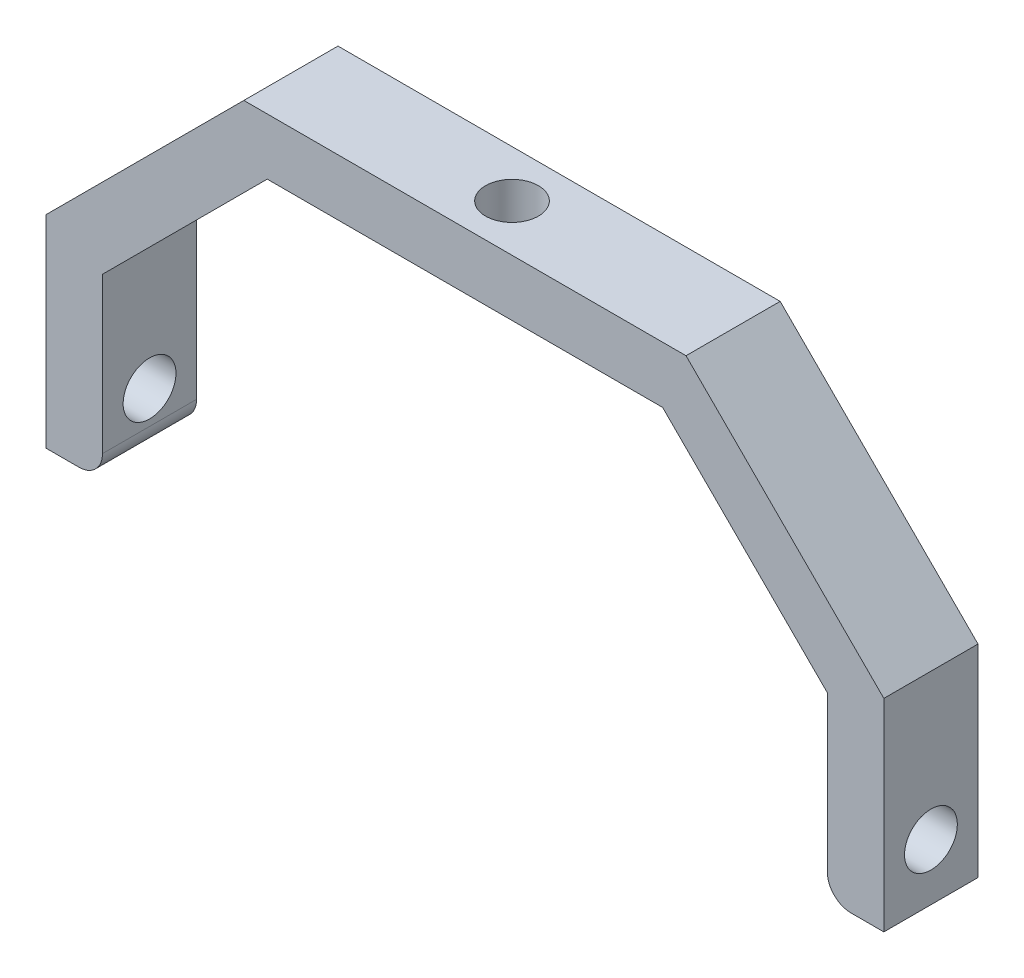
ISO-10303-21;
HEADER;
FILE_DESCRIPTION(('STEP AP214'),'2;1');
FILE_NAME('part.step','',(''),(''),'','','');
FILE_SCHEMA(('AUTOMOTIVE_DESIGN { 1 0 10303 214 1 1 1 1 }'));
ENDSEC;
DATA;
#1=APPLICATION_CONTEXT('core data for automotive mechanical design processes');
#2=APPLICATION_PROTOCOL_DEFINITION('international standard','automotive_design',2000,#1);
#3=PRODUCT_CONTEXT('',#1,'mechanical');
#4=PRODUCT('Part','Part','',(#3));
#5=PRODUCT_RELATED_PRODUCT_CATEGORY('part','',(#4));
#6=PRODUCT_DEFINITION_FORMATION('','',#4);
#7=PRODUCT_DEFINITION_CONTEXT('part definition',#1,'design');
#8=PRODUCT_DEFINITION('design','',#6,#7);
#9=PRODUCT_DEFINITION_SHAPE('','',#8);
#10=(LENGTH_UNIT() NAMED_UNIT(*) SI_UNIT(.MILLI.,.METRE.));
#11=(NAMED_UNIT(*) PLANE_ANGLE_UNIT() SI_UNIT($,.RADIAN.));
#12=(NAMED_UNIT(*) SI_UNIT($,.STERADIAN.) SOLID_ANGLE_UNIT());
#13=UNCERTAINTY_MEASURE_WITH_UNIT(LENGTH_MEASURE(1.E-05),#10,'distance_accuracy_value','');
#14=(GEOMETRIC_REPRESENTATION_CONTEXT(3) GLOBAL_UNCERTAINTY_ASSIGNED_CONTEXT((#13)) GLOBAL_UNIT_ASSIGNED_CONTEXT((#10,
#11,#12)) REPRESENTATION_CONTEXT('',''));
#15=CARTESIAN_POINT('',(0.,0.,0.));
#16=DIRECTION('',(0.,0.,1.));
#17=DIRECTION('',(1.,0.,0.));
#18=AXIS2_PLACEMENT_3D('',#15,#16,#17);
#19=CARTESIAN_POINT('',(-44.4999999999995,15.4852813742385,10.));
#20=DIRECTION('',(1.,0.,0.));
#21=DIRECTION('',(0.,1.,0.));
#22=AXIS2_PLACEMENT_3D('',#19,#20,#21);
#23=PLANE('',#22);
#24=CARTESIAN_POINT('',(-44.4999999999995,0.,5.));
#25=DIRECTION('',(-1.,0.,0.));
#26=DIRECTION('',(0.,0.,-1.));
#27=AXIS2_PLACEMENT_3D('',#24,#25,#26);
#28=CIRCLE('',#27,2.8067);
#29=CARTESIAN_POINT('',(-44.4999999999995,0.,2.1933));
#30=VERTEX_POINT('',#29);
#31=EDGE_CURVE('E457',#30,#30,#28,.T.);
#32=ORIENTED_EDGE('',*,*,#31,.F.);
#33=EDGE_LOOP('',(#32));
#34=FACE_BOUND('',#33,.T.);
#35=DIRECTION('',(0.,-1.,0.));
#36=VECTOR('',#35,1.);
#37=CARTESIAN_POINT('',(-44.4999999999995,15.4852813742385,0.));
#38=LINE('',#37,#36);
#39=CARTESIAN_POINT('',(-44.4999999999995,15.4852813742385,0.));
#40=VERTEX_POINT('',#39);
#41=CARTESIAN_POINT('',(-44.4999999999994,-6.,0.));
#42=VERTEX_POINT('',#41);
#43=EDGE_CURVE('E163',#40,#42,#38,.T.);
#44=ORIENTED_EDGE('',*,*,#43,.T.);
#45=DIRECTION('',(0.,0.,-1.));
#46=VECTOR('',#45,1.);
#47=CARTESIAN_POINT('',(-44.4999999999994,-6.,10.));
#48=LINE('',#47,#46);
#49=CARTESIAN_POINT('',(-44.4999999999994,-6.,10.));
#50=VERTEX_POINT('',#49);
#51=EDGE_CURVE('E145',#50,#42,#48,.T.);
#52=ORIENTED_EDGE('',*,*,#51,.F.);
#53=DIRECTION('',(0.,-1.,0.));
#54=VECTOR('',#53,1.);
#55=CARTESIAN_POINT('',(-44.4999999999995,15.4852813742385,10.));
#56=LINE('',#55,#54);
#57=CARTESIAN_POINT('',(-44.4999999999995,15.4852813742385,10.));
#58=VERTEX_POINT('',#57);
#59=EDGE_CURVE('E149',#58,#50,#56,.T.);
#60=ORIENTED_EDGE('',*,*,#59,.F.);
#61=DIRECTION('',(0.,0.,-1.));
#62=VECTOR('',#61,1.);
#63=CARTESIAN_POINT('',(-44.4999999999995,15.4852813742385,10.));
#64=LINE('',#63,#62);
#65=EDGE_CURVE('E239',#58,#40,#64,.T.);
#66=ORIENTED_EDGE('',*,*,#65,.T.);
#67=EDGE_LOOP('',(#44,#52,#60,#66));
#68=FACE_BOUND('',#67,.T.);
#69=ADVANCED_FACE('F41',(#34,#68),#23,.F.);
#70=CARTESIAN_POINT('',(-44.4999999999994,-6.,10.));
#71=DIRECTION('',(0.,1.,0.));
#72=DIRECTION('',(-1.,0.,0.));
#73=AXIS2_PLACEMENT_3D('',#70,#71,#72);
#74=PLANE('',#73);
#75=DIRECTION('',(1.,0.,0.));
#76=VECTOR('',#75,1.);
#77=CARTESIAN_POINT('',(-44.4999999999994,-6.,0.));
#78=LINE('',#77,#76);
#79=CARTESIAN_POINT('',(-40.9999999999994,-6.,0.));
#80=VERTEX_POINT('',#79);
#81=EDGE_CURVE('E207',#42,#80,#78,.T.);
#82=ORIENTED_EDGE('',*,*,#81,.T.);
#83=DIRECTION('',(0.,0.,-1.));
#84=VECTOR('',#83,1.);
#85=CARTESIAN_POINT('',(-40.9999999999994,-6.,10.));
#86=LINE('',#85,#84);
#87=CARTESIAN_POINT('',(-40.9999999999994,-6.,10.));
#88=VERTEX_POINT('',#87);
#89=EDGE_CURVE('E11',#80,#88,#86,.F.);
#90=ORIENTED_EDGE('',*,*,#89,.T.);
#91=DIRECTION('',(1.,0.,0.));
#92=VECTOR('',#91,1.);
#93=CARTESIAN_POINT('',(-44.4999999999994,-6.,10.));
#94=LINE('',#93,#92);
#95=EDGE_CURVE('E141',#50,#88,#94,.T.);
#96=ORIENTED_EDGE('',*,*,#95,.F.);
#97=ORIENTED_EDGE('',*,*,#51,.T.);
#98=EDGE_LOOP('',(#82,#90,#96,#97));
#99=FACE_BOUND('',#98,.T.);
#100=ADVANCED_FACE('F143',(#99),#74,.F.);
#101=CARTESIAN_POINT('',(-38.4999999999994,-6.,10.));
#102=DIRECTION('',(-1.,0.,0.));
#103=DIRECTION('',(0.,-1.,0.));
#104=AXIS2_PLACEMENT_3D('',#101,#102,#103);
#105=PLANE('',#104);
#106=CARTESIAN_POINT('',(-38.4999999999994,0.,5.));
#107=DIRECTION('',(-1.,0.,0.));
#108=DIRECTION('',(0.,-1.,0.));
#109=AXIS2_PLACEMENT_3D('',#106,#107,#108);
#110=CIRCLE('',#109,2.8067);
#111=CARTESIAN_POINT('',(-38.4999999999994,-2.8067,5.));
#112=VERTEX_POINT('',#111);
#113=EDGE_CURVE('E45',#112,#112,#110,.F.);
#114=ORIENTED_EDGE('',*,*,#113,.F.);
#115=EDGE_LOOP('',(#114));
#116=FACE_BOUND('',#115,.T.);
#117=DIRECTION('',(0.,1.,0.));
#118=VECTOR('',#117,1.);
#119=CARTESIAN_POINT('',(-38.4999999999994,-6.,10.));
#120=LINE('',#119,#118);
#121=CARTESIAN_POINT('',(-38.4999999999994,-3.49999999999998,10.));
#122=VERTEX_POINT('',#121);
#123=CARTESIAN_POINT('',(-38.4999999999995,13.,10.));
#124=VERTEX_POINT('',#123);
#125=EDGE_CURVE('E148',#122,#124,#120,.T.);
#126=ORIENTED_EDGE('',*,*,#125,.F.);
#127=DIRECTION('',(0.,0.,-1.));
#128=VECTOR('',#127,1.);
#129=CARTESIAN_POINT('',(-38.4999999999994,-3.49999999999998,10.));
#130=LINE('',#129,#128);
#131=CARTESIAN_POINT('',(-38.4999999999994,-3.49999999999998,0.));
#132=VERTEX_POINT('',#131);
#133=EDGE_CURVE('E51',#122,#132,#130,.T.);
#134=ORIENTED_EDGE('',*,*,#133,.T.);
#135=DIRECTION('',(0.,1.,0.));
#136=VECTOR('',#135,1.);
#137=CARTESIAN_POINT('',(-38.4999999999994,-6.,0.));
#138=LINE('',#137,#136);
#139=CARTESIAN_POINT('',(-38.4999999999995,13.,0.));
#140=VERTEX_POINT('',#139);
#141=EDGE_CURVE('E198',#132,#140,#138,.T.);
#142=ORIENTED_EDGE('',*,*,#141,.T.);
#143=DIRECTION('',(0.,0.,-1.));
#144=VECTOR('',#143,1.);
#145=CARTESIAN_POINT('',(-38.4999999999995,13.,10.));
#146=LINE('',#145,#144);
#147=EDGE_CURVE('E166',#124,#140,#146,.T.);
#148=ORIENTED_EDGE('',*,*,#147,.F.);
#149=EDGE_LOOP('',(#126,#134,#142,#148));
#150=FACE_BOUND('',#149,.T.);
#151=ADVANCED_FACE('F196',(#116,#150),#105,.F.);
#152=CARTESIAN_POINT('',(-38.4999999999995,13.,10.));
#153=DIRECTION('',(-0.707106781186566,0.707106781186529,0.));
#154=DIRECTION('',(-0.707106781186529,-0.707106781186566,0.));
#155=AXIS2_PLACEMENT_3D('',#152,#153,#154);
#156=PLANE('',#155);
#157=DIRECTION('',(0.707106781186529,0.707106781186566,0.));
#158=VECTOR('',#157,1.);
#159=CARTESIAN_POINT('',(-38.4999999999995,13.,0.));
#160=LINE('',#159,#158);
#161=CARTESIAN_POINT('',(-21.0000000000005,30.5,0.));
#162=VERTEX_POINT('',#161);
#163=EDGE_CURVE('E205',#140,#162,#160,.T.);
#164=ORIENTED_EDGE('',*,*,#163,.T.);
#165=DIRECTION('',(0.,0.,-1.));
#166=VECTOR('',#165,1.);
#167=CARTESIAN_POINT('',(-21.0000000000005,30.5,10.));
#168=LINE('',#167,#166);
#169=CARTESIAN_POINT('',(-21.0000000000005,30.5,10.));
#170=VERTEX_POINT('',#169);
#171=EDGE_CURVE('E174',#170,#162,#168,.T.);
#172=ORIENTED_EDGE('',*,*,#171,.F.);
#173=DIRECTION('',(0.707106781186529,0.707106781186566,0.));
#174=VECTOR('',#173,1.);
#175=CARTESIAN_POINT('',(-38.4999999999995,13.,10.));
#176=LINE('',#175,#174);
#177=EDGE_CURVE('E322',#124,#170,#176,.T.);
#178=ORIENTED_EDGE('',*,*,#177,.F.);
#179=ORIENTED_EDGE('',*,*,#147,.T.);
#180=EDGE_LOOP('',(#164,#172,#178,#179));
#181=FACE_BOUND('',#180,.T.);
#182=ADVANCED_FACE('F325',(#181),#156,.F.);
#183=CARTESIAN_POINT('',(-21.0000000000005,30.5,10.));
#184=DIRECTION('',(0.,1.,0.));
#185=DIRECTION('',(-1.,0.,0.));
#186=AXIS2_PLACEMENT_3D('',#183,#184,#185);
#187=PLANE('',#186);
#188=CARTESIAN_POINT('',(-1.06707021269213E-13,30.5,5.));
#189=DIRECTION('',(0.,1.,0.));
#190=DIRECTION('',(-1.,0.,0.));
#191=AXIS2_PLACEMENT_3D('',#188,#189,#190);
#192=CIRCLE('',#191,2.8067);
#193=CARTESIAN_POINT('',(-2.80670000000011,30.5,5.));
#194=VERTEX_POINT('',#193);
#195=EDGE_CURVE('E461',#194,#194,#192,.F.);
#196=ORIENTED_EDGE('',*,*,#195,.F.);
#197=EDGE_LOOP('',(#196));
#198=FACE_BOUND('',#197,.T.);
#199=DIRECTION('',(1.,0.,0.));
#200=VECTOR('',#199,1.);
#201=CARTESIAN_POINT('',(-21.0000000000005,30.5,0.));
#202=LINE('',#201,#200);
#203=CARTESIAN_POINT('',(21.0000000000005,30.5,0.));
#204=VERTEX_POINT('',#203);
#205=EDGE_CURVE('E211',#162,#204,#202,.T.);
#206=ORIENTED_EDGE('',*,*,#205,.T.);
#207=DIRECTION('',(0.,0.,-1.));
#208=VECTOR('',#207,1.);
#209=CARTESIAN_POINT('',(21.0000000000005,30.5,10.));
#210=LINE('',#209,#208);
#211=CARTESIAN_POINT('',(21.0000000000005,30.5,10.));
#212=VERTEX_POINT('',#211);
#213=EDGE_CURVE('E262',#212,#204,#210,.T.);
#214=ORIENTED_EDGE('',*,*,#213,.F.);
#215=DIRECTION('',(1.,0.,0.));
#216=VECTOR('',#215,1.);
#217=CARTESIAN_POINT('',(-21.0000000000005,30.5,10.));
#218=LINE('',#217,#216);
#219=EDGE_CURVE('E272',#170,#212,#218,.T.);
#220=ORIENTED_EDGE('',*,*,#219,.F.);
#221=ORIENTED_EDGE('',*,*,#171,.T.);
#222=EDGE_LOOP('',(#206,#214,#220,#221));
#223=FACE_BOUND('',#222,.T.);
#224=ADVANCED_FACE('F270',(#198,#223),#187,.F.);
#225=CARTESIAN_POINT('',(21.0000000000005,30.5,10.));
#226=DIRECTION('',(0.707106781186522,0.707106781186573,0.));
#227=DIRECTION('',(-0.707106781186573,0.707106781186522,0.));
#228=AXIS2_PLACEMENT_3D('',#225,#226,#227);
#229=PLANE('',#228);
#230=DIRECTION('',(0.707106781186573,-0.707106781186522,0.));
#231=VECTOR('',#230,1.);
#232=CARTESIAN_POINT('',(21.0000000000005,30.5,0.));
#233=LINE('',#232,#231);
#234=CARTESIAN_POINT('',(38.5000000000005,13.0000000000013,0.));
#235=VERTEX_POINT('',#234);
#236=EDGE_CURVE('E218',#204,#235,#233,.T.);
#237=ORIENTED_EDGE('',*,*,#236,.T.);
#238=DIRECTION('',(0.,0.,-1.));
#239=VECTOR('',#238,1.);
#240=CARTESIAN_POINT('',(38.5000000000005,13.0000000000013,10.));
#241=LINE('',#240,#239);
#242=CARTESIAN_POINT('',(38.5000000000005,13.0000000000013,10.));
#243=VERTEX_POINT('',#242);
#244=EDGE_CURVE('E258',#243,#235,#241,.T.);
#245=ORIENTED_EDGE('',*,*,#244,.F.);
#246=DIRECTION('',(0.707106781186573,-0.707106781186522,0.));
#247=VECTOR('',#246,1.);
#248=CARTESIAN_POINT('',(21.0000000000005,30.5,10.));
#249=LINE('',#248,#247);
#250=EDGE_CURVE('E289',#212,#243,#249,.T.);
#251=ORIENTED_EDGE('',*,*,#250,.F.);
#252=ORIENTED_EDGE('',*,*,#213,.T.);
#253=EDGE_LOOP('',(#237,#245,#251,#252));
#254=FACE_BOUND('',#253,.T.);
#255=ADVANCED_FACE('F279',(#254),#229,.F.);
#256=CARTESIAN_POINT('',(38.5000000000005,13.0000000000013,10.));
#257=DIRECTION('',(1.,0.,0.));
#258=DIRECTION('',(0.,1.,0.));
#259=AXIS2_PLACEMENT_3D('',#256,#257,#258);
#260=PLANE('',#259);
#261=CARTESIAN_POINT('',(38.5000000000006,0.,5.));
#262=DIRECTION('',(1.,0.,0.));
#263=DIRECTION('',(0.,1.,0.));
#264=AXIS2_PLACEMENT_3D('',#261,#262,#263);
#265=CIRCLE('',#264,2.8067);
#266=CARTESIAN_POINT('',(38.5000000000005,2.8067,5.));
#267=VERTEX_POINT('',#266);
#268=EDGE_CURVE('E308',#267,#267,#265,.F.);
#269=ORIENTED_EDGE('',*,*,#268,.F.);
#270=EDGE_LOOP('',(#269));
#271=FACE_BOUND('',#270,.T.);
#272=DIRECTION('',(0.,-1.,0.));
#273=VECTOR('',#272,1.);
#274=CARTESIAN_POINT('',(38.5000000000005,13.0000000000013,0.));
#275=LINE('',#274,#273);
#276=CARTESIAN_POINT('',(38.5000000000006,-3.50000000000002,0.));
#277=VERTEX_POINT('',#276);
#278=EDGE_CURVE('E221',#235,#277,#275,.T.);
#279=ORIENTED_EDGE('',*,*,#278,.T.);
#280=DIRECTION('',(0.,0.,-1.));
#281=VECTOR('',#280,1.);
#282=CARTESIAN_POINT('',(38.5000000000006,-3.50000000000002,10.));
#283=LINE('',#282,#281);
#284=CARTESIAN_POINT('',(38.5000000000006,-3.50000000000002,10.));
#285=VERTEX_POINT('',#284);
#286=EDGE_CURVE('E183',#277,#285,#283,.F.);
#287=ORIENTED_EDGE('',*,*,#286,.T.);
#288=DIRECTION('',(0.,-1.,0.));
#289=VECTOR('',#288,1.);
#290=CARTESIAN_POINT('',(38.5000000000005,13.0000000000013,10.));
#291=LINE('',#290,#289);
#292=EDGE_CURVE('E285',#243,#285,#291,.T.);
#293=ORIENTED_EDGE('',*,*,#292,.F.);
#294=ORIENTED_EDGE('',*,*,#244,.T.);
#295=EDGE_LOOP('',(#279,#287,#293,#294));
#296=FACE_BOUND('',#295,.T.);
#297=ADVANCED_FACE('F283',(#271,#296),#260,.F.);
#298=CARTESIAN_POINT('',(38.5000000000006,-6.,10.));
#299=DIRECTION('',(0.,1.,0.));
#300=DIRECTION('',(0.,0.,1.));
#301=AXIS2_PLACEMENT_3D('',#298,#299,#300);
#302=PLANE('',#301);
#303=DIRECTION('',(1.,0.,0.));
#304=VECTOR('',#303,1.);
#305=CARTESIAN_POINT('',(38.5000000000006,-6.,10.));
#306=LINE('',#305,#304);
#307=CARTESIAN_POINT('',(41.0000000000006,-6.,10.));
#308=VERTEX_POINT('',#307);
#309=CARTESIAN_POINT('',(44.5000000000006,-6.,10.));
#310=VERTEX_POINT('',#309);
#311=EDGE_CURVE('E288',#308,#310,#306,.T.);
#312=ORIENTED_EDGE('',*,*,#311,.F.);
#313=DIRECTION('',(0.,0.,-1.));
#314=VECTOR('',#313,1.);
#315=CARTESIAN_POINT('',(41.0000000000006,-6.,10.));
#316=LINE('',#315,#314);
#317=CARTESIAN_POINT('',(41.0000000000006,-6.,0.));
#318=VERTEX_POINT('',#317);
#319=EDGE_CURVE('E165',#308,#318,#316,.T.);
#320=ORIENTED_EDGE('',*,*,#319,.T.);
#321=DIRECTION('',(1.,0.,0.));
#322=VECTOR('',#321,1.);
#323=CARTESIAN_POINT('',(38.5000000000006,-6.,0.));
#324=LINE('',#323,#322);
#325=CARTESIAN_POINT('',(44.5000000000006,-6.,0.));
#326=VERTEX_POINT('',#325);
#327=EDGE_CURVE('E225',#318,#326,#324,.T.);
#328=ORIENTED_EDGE('',*,*,#327,.T.);
#329=DIRECTION('',(0.,0.,-1.));
#330=VECTOR('',#329,1.);
#331=CARTESIAN_POINT('',(44.5000000000006,-6.,10.));
#332=LINE('',#331,#330);
#333=EDGE_CURVE('E254',#310,#326,#332,.T.);
#334=ORIENTED_EDGE('',*,*,#333,.F.);
#335=EDGE_LOOP('',(#312,#320,#328,#334));
#336=FACE_BOUND('',#335,.T.);
#337=ADVANCED_FACE('F359',(#336),#302,.F.);
#338=CARTESIAN_POINT('',(44.5000000000006,-6.,10.));
#339=DIRECTION('',(-1.,0.,0.));
#340=DIRECTION('',(0.,-1.,0.));
#341=AXIS2_PLACEMENT_3D('',#338,#339,#340);
#342=PLANE('',#341);
#343=CARTESIAN_POINT('',(44.5000000000006,0.,5.));
#344=DIRECTION('',(1.,0.,0.));
#345=DIRECTION('',(0.,0.,-1.));
#346=AXIS2_PLACEMENT_3D('',#343,#344,#345);
#347=CIRCLE('',#346,2.8067);
#348=CARTESIAN_POINT('',(44.5000000000006,0.,2.1933));
#349=VERTEX_POINT('',#348);
#350=EDGE_CURVE('E311',#349,#349,#347,.T.);
#351=ORIENTED_EDGE('',*,*,#350,.F.);
#352=EDGE_LOOP('',(#351));
#353=FACE_BOUND('',#352,.T.);
#354=DIRECTION('',(0.,1.,0.));
#355=VECTOR('',#354,1.);
#356=CARTESIAN_POINT('',(44.5000000000006,-6.,0.));
#357=LINE('',#356,#355);
#358=CARTESIAN_POINT('',(44.5000000000005,15.4852813742399,0.));
#359=VERTEX_POINT('',#358);
#360=EDGE_CURVE('E228',#326,#359,#357,.T.);
#361=ORIENTED_EDGE('',*,*,#360,.T.);
#362=DIRECTION('',(0.,0.,-1.));
#363=VECTOR('',#362,1.);
#364=CARTESIAN_POINT('',(44.5000000000005,15.4852813742399,10.));
#365=LINE('',#364,#363);
#366=CARTESIAN_POINT('',(44.5000000000005,15.4852813742399,10.));
#367=VERTEX_POINT('',#366);
#368=EDGE_CURVE('E250',#367,#359,#365,.T.);
#369=ORIENTED_EDGE('',*,*,#368,.F.);
#370=DIRECTION('',(0.,1.,0.));
#371=VECTOR('',#370,1.);
#372=CARTESIAN_POINT('',(44.5000000000006,-6.,10.));
#373=LINE('',#372,#371);
#374=EDGE_CURVE('E293',#310,#367,#373,.T.);
#375=ORIENTED_EDGE('',*,*,#374,.F.);
#376=ORIENTED_EDGE('',*,*,#333,.T.);
#377=EDGE_LOOP('',(#361,#369,#375,#376));
#378=FACE_BOUND('',#377,.T.);
#379=ADVANCED_FACE('F364',(#353,#378),#342,.F.);
#380=CARTESIAN_POINT('',(44.5000000000005,15.4852813742399,10.));
#381=DIRECTION('',(-0.707106781186529,-0.707106781186566,0.));
#382=DIRECTION('',(0.707106781186566,-0.707106781186529,0.));
#383=AXIS2_PLACEMENT_3D('',#380,#381,#382);
#384=PLANE('',#383);
#385=DIRECTION('',(-0.707106781186566,0.707106781186529,0.));
#386=VECTOR('',#385,1.);
#387=CARTESIAN_POINT('',(44.5000000000005,15.4852813742399,0.));
#388=LINE('',#387,#386);
#389=CARTESIAN_POINT('',(23.4852813742393,36.5,0.));
#390=VERTEX_POINT('',#389);
#391=EDGE_CURVE('E231',#359,#390,#388,.T.);
#392=ORIENTED_EDGE('',*,*,#391,.T.);
#393=DIRECTION('',(0.,0.,-1.));
#394=VECTOR('',#393,1.);
#395=CARTESIAN_POINT('',(23.4852813742393,36.5,10.));
#396=LINE('',#395,#394);
#397=CARTESIAN_POINT('',(23.4852813742393,36.5,10.));
#398=VERTEX_POINT('',#397);
#399=EDGE_CURVE('E246',#398,#390,#396,.T.);
#400=ORIENTED_EDGE('',*,*,#399,.F.);
#401=DIRECTION('',(-0.707106781186566,0.707106781186529,0.));
#402=VECTOR('',#401,1.);
#403=CARTESIAN_POINT('',(44.5000000000005,15.4852813742399,10.));
#404=LINE('',#403,#402);
#405=EDGE_CURVE('E300',#367,#398,#404,.T.);
#406=ORIENTED_EDGE('',*,*,#405,.F.);
#407=ORIENTED_EDGE('',*,*,#368,.T.);
#408=EDGE_LOOP('',(#392,#400,#406,#407));
#409=FACE_BOUND('',#408,.T.);
#410=ADVANCED_FACE('F370',(#409),#384,.F.);
#411=CARTESIAN_POINT('',(23.4852813742393,36.5,10.));
#412=DIRECTION('',(0.,-1.,0.));
#413=DIRECTION('',(1.,0.,0.));
#414=AXIS2_PLACEMENT_3D('',#411,#412,#413);
#415=PLANE('',#414);
#416=CARTESIAN_POINT('',(-1.27655909302272E-13,36.5000000000002,5.));
#417=DIRECTION('',(0.,1.,0.));
#418=DIRECTION('',(0.,0.,-1.));
#419=AXIS2_PLACEMENT_3D('',#416,#417,#418);
#420=CIRCLE('',#419,2.8067);
#421=CARTESIAN_POINT('',(-1.27655909302272E-13,36.5000000000002,2.1933));
#422=VERTEX_POINT('',#421);
#423=EDGE_CURVE('E464',#422,#422,#420,.T.);
#424=ORIENTED_EDGE('',*,*,#423,.F.);
#425=EDGE_LOOP('',(#424));
#426=FACE_BOUND('',#425,.T.);
#427=DIRECTION('',(-1.,0.,0.));
#428=VECTOR('',#427,1.);
#429=CARTESIAN_POINT('',(23.4852813742393,36.5,0.));
#430=LINE('',#429,#428);
#431=CARTESIAN_POINT('',(-23.4852813742391,36.5,0.));
#432=VERTEX_POINT('',#431);
#433=EDGE_CURVE('E234',#390,#432,#430,.T.);
#434=ORIENTED_EDGE('',*,*,#433,.T.);
#435=DIRECTION('',(0.,0.,-1.));
#436=VECTOR('',#435,1.);
#437=CARTESIAN_POINT('',(-23.4852813742391,36.5,10.));
#438=LINE('',#437,#436);
#439=CARTESIAN_POINT('',(-23.4852813742391,36.5,10.));
#440=VERTEX_POINT('',#439);
#441=EDGE_CURVE('E242',#440,#432,#438,.T.);
#442=ORIENTED_EDGE('',*,*,#441,.F.);
#443=DIRECTION('',(-1.,0.,0.));
#444=VECTOR('',#443,1.);
#445=CARTESIAN_POINT('',(23.4852813742393,36.5,10.));
#446=LINE('',#445,#444);
#447=EDGE_CURVE('E303',#398,#440,#446,.T.);
#448=ORIENTED_EDGE('',*,*,#447,.F.);
#449=ORIENTED_EDGE('',*,*,#399,.T.);
#450=EDGE_LOOP('',(#434,#442,#448,#449));
#451=FACE_BOUND('',#450,.T.);
#452=ADVANCED_FACE('F374',(#426,#451),#415,.F.);
#453=CARTESIAN_POINT('',(-23.4852813742391,36.5,10.));
#454=DIRECTION('',(0.707106781186566,-0.707106781186529,0.));
#455=DIRECTION('',(0.707106781186529,0.707106781186566,0.));
#456=AXIS2_PLACEMENT_3D('',#453,#454,#455);
#457=PLANE('',#456);
#458=DIRECTION('',(-0.707106781186529,-0.707106781186566,0.));
#459=VECTOR('',#458,1.);
#460=CARTESIAN_POINT('',(-23.4852813742391,36.5,0.));
#461=LINE('',#460,#459);
#462=EDGE_CURVE('E160',#432,#40,#461,.T.);
#463=ORIENTED_EDGE('',*,*,#462,.T.);
#464=ORIENTED_EDGE('',*,*,#65,.F.);
#465=DIRECTION('',(-0.707106781186529,-0.707106781186566,0.));
#466=VECTOR('',#465,1.);
#467=CARTESIAN_POINT('',(-23.4852813742391,36.5,10.));
#468=LINE('',#467,#466);
#469=EDGE_CURVE('E155',#440,#58,#468,.T.);
#470=ORIENTED_EDGE('',*,*,#469,.F.);
#471=ORIENTED_EDGE('',*,*,#441,.T.);
#472=EDGE_LOOP('',(#463,#464,#470,#471));
#473=FACE_BOUND('',#472,.T.);
#474=ADVANCED_FACE('F377',(#473),#457,.F.);
#475=CARTESIAN_POINT('',(0.,0.,10.));
#476=DIRECTION('',(0.,0.,1.));
#477=DIRECTION('',(1.,0.,0.));
#478=AXIS2_PLACEMENT_3D('',#475,#476,#477);
#479=PLANE('',#478);
#480=ORIENTED_EDGE('',*,*,#292,.T.);
#481=CARTESIAN_POINT('',(41.0000000000006,-3.5,10.));
#482=DIRECTION('',(0.,0.,1.));
#483=DIRECTION('',(1.,0.,0.));
#484=AXIS2_PLACEMENT_3D('',#481,#482,#483);
#485=CIRCLE('',#484,2.5);
#486=EDGE_CURVE('E188',#285,#308,#485,.T.);
#487=ORIENTED_EDGE('',*,*,#486,.T.);
#488=ORIENTED_EDGE('',*,*,#311,.T.);
#489=ORIENTED_EDGE('',*,*,#374,.T.);
#490=ORIENTED_EDGE('',*,*,#405,.T.);
#491=ORIENTED_EDGE('',*,*,#447,.T.);
#492=ORIENTED_EDGE('',*,*,#469,.T.);
#493=ORIENTED_EDGE('',*,*,#59,.T.);
#494=ORIENTED_EDGE('',*,*,#95,.T.);
#495=CARTESIAN_POINT('',(-40.9999999999994,-3.5,10.));
#496=DIRECTION('',(0.,0.,1.));
#497=DIRECTION('',(1.,0.,0.));
#498=AXIS2_PLACEMENT_3D('',#495,#496,#497);
#499=CIRCLE('',#498,2.5);
#500=EDGE_CURVE('E58',#88,#122,#499,.T.);
#501=ORIENTED_EDGE('',*,*,#500,.T.);
#502=ORIENTED_EDGE('',*,*,#125,.T.);
#503=ORIENTED_EDGE('',*,*,#177,.T.);
#504=ORIENTED_EDGE('',*,*,#219,.T.);
#505=ORIENTED_EDGE('',*,*,#250,.T.);
#506=EDGE_LOOP('',(#480,#487,#488,#489,#490,#491,#492,#493,#494,#501,#502,#503,#504,#505));
#507=FACE_BOUND('',#506,.T.);
#508=ADVANCED_FACE('F153',(#507),#479,.T.);
#509=CARTESIAN_POINT('',(0.,0.,0.));
#510=DIRECTION('',(0.,0.,1.));
#511=DIRECTION('',(1.,0.,0.));
#512=AXIS2_PLACEMENT_3D('',#509,#510,#511);
#513=PLANE('',#512);
#514=ORIENTED_EDGE('',*,*,#327,.F.);
#515=CARTESIAN_POINT('',(41.0000000000006,-3.5,0.));
#516=DIRECTION('',(0.,0.,1.));
#517=DIRECTION('',(1.,0.,0.));
#518=AXIS2_PLACEMENT_3D('',#515,#516,#517);
#519=CIRCLE('',#518,2.5);
#520=EDGE_CURVE('E180',#318,#277,#519,.F.);
#521=ORIENTED_EDGE('',*,*,#520,.T.);
#522=ORIENTED_EDGE('',*,*,#278,.F.);
#523=ORIENTED_EDGE('',*,*,#236,.F.);
#524=ORIENTED_EDGE('',*,*,#205,.F.);
#525=ORIENTED_EDGE('',*,*,#163,.F.);
#526=ORIENTED_EDGE('',*,*,#141,.F.);
#527=CARTESIAN_POINT('',(-40.9999999999994,-3.5,0.));
#528=DIRECTION('',(0.,0.,1.));
#529=DIRECTION('',(1.,0.,0.));
#530=AXIS2_PLACEMENT_3D('',#527,#528,#529);
#531=CIRCLE('',#530,2.5);
#532=EDGE_CURVE('E171',#132,#80,#531,.F.);
#533=ORIENTED_EDGE('',*,*,#532,.T.);
#534=ORIENTED_EDGE('',*,*,#81,.F.);
#535=ORIENTED_EDGE('',*,*,#43,.F.);
#536=ORIENTED_EDGE('',*,*,#462,.F.);
#537=ORIENTED_EDGE('',*,*,#433,.F.);
#538=ORIENTED_EDGE('',*,*,#391,.F.);
#539=ORIENTED_EDGE('',*,*,#360,.F.);
#540=EDGE_LOOP('',(#514,#521,#522,#523,#524,#525,#526,#533,#534,#535,#536,#537,#538,#539));
#541=FACE_BOUND('',#540,.T.);
#542=ADVANCED_FACE('F203',(#541),#513,.F.);
#543=CARTESIAN_POINT('',(44.5000000000006,0.,5.));
#544=DIRECTION('',(-1.,0.,0.));
#545=DIRECTION('',(0.,0.,1.));
#546=AXIS2_PLACEMENT_3D('',#543,#544,#545);
#547=CYLINDRICAL_SURFACE('',#546,2.8067);
#548=ORIENTED_EDGE('',*,*,#350,.T.);
#549=EDGE_LOOP('',(#548));
#550=FACE_BOUND('',#549,.T.);
#551=ORIENTED_EDGE('',*,*,#268,.T.);
#552=EDGE_LOOP('',(#551));
#553=FACE_BOUND('',#552,.T.);
#554=ADVANCED_FACE('F346',(#550,#553),#547,.F.);
#555=CARTESIAN_POINT('',(41.0000000000006,-3.5,10.));
#556=DIRECTION('',(0.,0.,-1.));
#557=DIRECTION('',(-1.,0.,0.));
#558=AXIS2_PLACEMENT_3D('',#555,#556,#557);
#559=CYLINDRICAL_SURFACE('',#558,2.5);
#560=ORIENTED_EDGE('',*,*,#486,.F.);
#561=ORIENTED_EDGE('',*,*,#286,.F.);
#562=ORIENTED_EDGE('',*,*,#520,.F.);
#563=ORIENTED_EDGE('',*,*,#319,.F.);
#564=EDGE_LOOP('',(#560,#561,#562,#563));
#565=FACE_BOUND('',#564,.T.);
#566=ADVANCED_FACE('F344',(#565),#559,.T.);
#567=CARTESIAN_POINT('',(-40.9999999999994,-3.5,10.));
#568=DIRECTION('',(0.,0.,-1.));
#569=DIRECTION('',(-1.,0.,0.));
#570=AXIS2_PLACEMENT_3D('',#567,#568,#569);
#571=CYLINDRICAL_SURFACE('',#570,2.5);
#572=ORIENTED_EDGE('',*,*,#500,.F.);
#573=ORIENTED_EDGE('',*,*,#89,.F.);
#574=ORIENTED_EDGE('',*,*,#532,.F.);
#575=ORIENTED_EDGE('',*,*,#133,.F.);
#576=EDGE_LOOP('',(#572,#573,#574,#575));
#577=FACE_BOUND('',#576,.T.);
#578=ADVANCED_FACE('F43',(#577),#571,.T.);
#579=CARTESIAN_POINT('',(-1.27655909302272E-13,36.5000000000002,5.));
#580=DIRECTION('',(0.,-1.,0.));
#581=DIRECTION('',(1.,0.,0.));
#582=AXIS2_PLACEMENT_3D('',#579,#580,#581);
#583=CYLINDRICAL_SURFACE('',#582,2.8067);
#584=ORIENTED_EDGE('',*,*,#423,.T.);
#585=EDGE_LOOP('',(#584));
#586=FACE_BOUND('',#585,.T.);
#587=ORIENTED_EDGE('',*,*,#195,.T.);
#588=EDGE_LOOP('',(#587));
#589=FACE_BOUND('',#588,.T.);
#590=ADVANCED_FACE('F352',(#586,#589),#583,.F.);
#591=CARTESIAN_POINT('',(-44.4999999999995,0.,5.));
#592=DIRECTION('',(1.,0.,0.));
#593=DIRECTION('',(0.,0.,-1.));
#594=AXIS2_PLACEMENT_3D('',#591,#592,#593);
#595=CYLINDRICAL_SURFACE('',#594,2.8067);
#596=ORIENTED_EDGE('',*,*,#31,.T.);
#597=EDGE_LOOP('',(#596));
#598=FACE_BOUND('',#597,.T.);
#599=ORIENTED_EDGE('',*,*,#113,.T.);
#600=EDGE_LOOP('',(#599));
#601=FACE_BOUND('',#600,.T.);
#602=ADVANCED_FACE('F440',(#598,#601),#595,.F.);
#603=CLOSED_SHELL('',(#69,#100,#151,#182,#224,#255,#297,#337,#379,#410,#452,#474,#508,#542,#554,
#566,#578,#590,#602));
#604=MANIFOLD_SOLID_BREP('B2',#603);
#605=ADVANCED_BREP_SHAPE_REPRESENTATION('',(#18,#604),#14);
#606=SHAPE_DEFINITION_REPRESENTATION(#9,#605);
ENDSEC;
END-ISO-10303-21;
